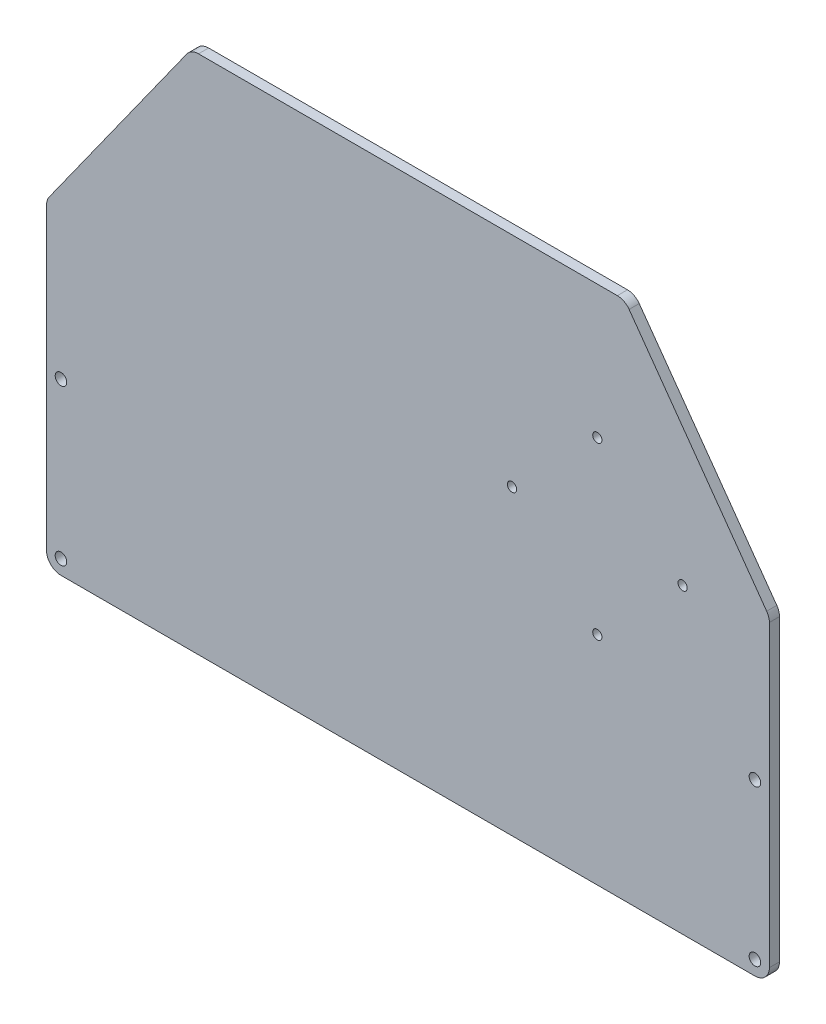
ISO-10303-21;
HEADER;
FILE_DESCRIPTION(('STEP AP214'),'2;1');
FILE_NAME('part.step','',(''),(''),'','','');
FILE_SCHEMA(('AUTOMOTIVE_DESIGN { 1 0 10303 214 1 1 1 1 }'));
ENDSEC;
DATA;
#1=APPLICATION_CONTEXT('core data for automotive mechanical design processes');
#2=APPLICATION_PROTOCOL_DEFINITION('international standard','automotive_design',2000,#1);
#3=PRODUCT_CONTEXT('',#1,'mechanical');
#4=PRODUCT('Part','Part','',(#3));
#5=PRODUCT_RELATED_PRODUCT_CATEGORY('part','',(#4));
#6=PRODUCT_DEFINITION_FORMATION('','',#4);
#7=PRODUCT_DEFINITION_CONTEXT('part definition',#1,'design');
#8=PRODUCT_DEFINITION('design','',#6,#7);
#9=PRODUCT_DEFINITION_SHAPE('','',#8);
#10=(LENGTH_UNIT() NAMED_UNIT(*) SI_UNIT(.MILLI.,.METRE.));
#11=(NAMED_UNIT(*) PLANE_ANGLE_UNIT() SI_UNIT($,.RADIAN.));
#12=(NAMED_UNIT(*) SI_UNIT($,.STERADIAN.) SOLID_ANGLE_UNIT());
#13=UNCERTAINTY_MEASURE_WITH_UNIT(LENGTH_MEASURE(1.E-05),#10,'distance_accuracy_value','');
#14=(GEOMETRIC_REPRESENTATION_CONTEXT(3) GLOBAL_UNCERTAINTY_ASSIGNED_CONTEXT((#13)) GLOBAL_UNIT_ASSIGNED_CONTEXT((#10,
#11,#12)) REPRESENTATION_CONTEXT('',''));
#15=CARTESIAN_POINT('',(0.,0.,0.));
#16=DIRECTION('',(0.,0.,1.));
#17=DIRECTION('',(1.,0.,0.));
#18=AXIS2_PLACEMENT_3D('',#15,#16,#17);
#19=CARTESIAN_POINT('',(250.,5.,3.5));
#20=DIRECTION('',(-1.,0.,0.));
#21=DIRECTION('',(0.,0.,1.));
#22=AXIS2_PLACEMENT_3D('',#19,#20,#21);
#23=PLANE('',#22);
#24=DIRECTION('',(0.,1.,0.));
#25=VECTOR('',#24,1.);
#26=CARTESIAN_POINT('',(250.,5.,0.));
#27=LINE('',#26,#25);
#28=CARTESIAN_POINT('',(250.,5.,0.));
#29=VERTEX_POINT('',#28);
#30=CARTESIAN_POINT('',(250.,108.397674732957,0.));
#31=VERTEX_POINT('',#30);
#32=EDGE_CURVE('E221',#29,#31,#27,.T.);
#33=ORIENTED_EDGE('',*,*,#32,.T.);
#34=DIRECTION('',(0.,0.,-1.));
#35=VECTOR('',#34,1.);
#36=CARTESIAN_POINT('',(250.,108.397674732957,3.5));
#37=LINE('',#36,#35);
#38=CARTESIAN_POINT('',(250.,108.397674732957,3.5));
#39=VERTEX_POINT('',#38);
#40=EDGE_CURVE('E175',#31,#39,#37,.F.);
#41=ORIENTED_EDGE('',*,*,#40,.T.);
#42=DIRECTION('',(0.,1.,0.));
#43=VECTOR('',#42,1.);
#44=CARTESIAN_POINT('',(250.,5.,3.5));
#45=LINE('',#44,#43);
#46=CARTESIAN_POINT('',(250.,5.,3.5));
#47=VERTEX_POINT('',#46);
#48=EDGE_CURVE('E209',#47,#39,#45,.T.);
#49=ORIENTED_EDGE('',*,*,#48,.F.);
#50=DIRECTION('',(0.,0.,-1.));
#51=VECTOR('',#50,1.);
#52=CARTESIAN_POINT('',(250.,5.,3.5));
#53=LINE('',#52,#51);
#54=EDGE_CURVE('E153',#47,#29,#53,.T.);
#55=ORIENTED_EDGE('',*,*,#54,.T.);
#56=EDGE_LOOP('',(#33,#41,#49,#55));
#57=FACE_BOUND('',#56,.T.);
#58=ADVANCED_FACE('F32',(#57),#23,.F.);
#59=CARTESIAN_POINT('',(0.,5.00000000000004,3.5));
#60=DIRECTION('',(1.,0.,0.));
#61=DIRECTION('',(0.,0.,-1.));
#62=AXIS2_PLACEMENT_3D('',#59,#60,#61);
#63=PLANE('',#62);
#64=DIRECTION('',(0.,-1.,0.));
#65=VECTOR('',#64,1.);
#66=CARTESIAN_POINT('',(0.,5.00000000000004,3.5));
#67=LINE('',#66,#65);
#68=CARTESIAN_POINT('',(0.,108.397674732957,3.5));
#69=VERTEX_POINT('',#68);
#70=CARTESIAN_POINT('',(0.,5.00000000000004,3.5));
#71=VERTEX_POINT('',#70);
#72=EDGE_CURVE('E139',#69,#71,#67,.T.);
#73=ORIENTED_EDGE('',*,*,#72,.F.);
#74=DIRECTION('',(0.,0.,-1.));
#75=VECTOR('',#74,1.);
#76=CARTESIAN_POINT('',(0.,108.397674732957,0.));
#77=LINE('',#76,#75);
#78=CARTESIAN_POINT('',(0.,108.397674732957,0.));
#79=VERTEX_POINT('',#78);
#80=EDGE_CURVE('E11',#69,#79,#77,.T.);
#81=ORIENTED_EDGE('',*,*,#80,.T.);
#82=DIRECTION('',(0.,-1.,0.));
#83=VECTOR('',#82,1.);
#84=CARTESIAN_POINT('',(0.,5.00000000000004,0.));
#85=LINE('',#84,#83);
#86=CARTESIAN_POINT('',(0.,5.00000000000004,0.));
#87=VERTEX_POINT('',#86);
#88=EDGE_CURVE('E143',#79,#87,#85,.T.);
#89=ORIENTED_EDGE('',*,*,#88,.T.);
#90=DIRECTION('',(0.,0.,-1.));
#91=VECTOR('',#90,1.);
#92=CARTESIAN_POINT('',(0.,5.00000000000004,3.5));
#93=LINE('',#92,#91);
#94=EDGE_CURVE('E208',#71,#87,#93,.T.);
#95=ORIENTED_EDGE('',*,*,#94,.F.);
#96=EDGE_LOOP('',(#73,#81,#89,#95));
#97=FACE_BOUND('',#96,.T.);
#98=ADVANCED_FACE('F207',(#97),#63,.F.);
#99=CARTESIAN_POINT('',(5.,5.,3.5));
#100=DIRECTION('',(0.,0.,-1.));
#101=DIRECTION('',(-1.,0.,0.));
#102=AXIS2_PLACEMENT_3D('',#99,#100,#101);
#103=PLANE('',#102);
#104=CARTESIAN_POINT('',(190.499010186097,134.,3.5));
#105=DIRECTION('',(0.,0.,1.));
#106=DIRECTION('',(1.,0.,0.));
#107=AXIS2_PLACEMENT_3D('',#104,#105,#106);
#108=CIRCLE('',#107,1.59999999999999);
#109=CARTESIAN_POINT('',(192.099010186097,134.,3.5));
#110=VERTEX_POINT('',#109);
#111=EDGE_CURVE('E340',#110,#110,#108,.T.);
#112=ORIENTED_EDGE('',*,*,#111,.F.);
#113=EDGE_LOOP('',(#112));
#114=FACE_BOUND('',#113,.T.);
#115=CARTESIAN_POINT('',(160.998020372194,104.5,3.5));
#116=DIRECTION('',(0.,0.,1.));
#117=DIRECTION('',(1.,0.,0.));
#118=AXIS2_PLACEMENT_3D('',#115,#116,#117);
#119=CIRCLE('',#118,1.59999999999999);
#120=CARTESIAN_POINT('',(162.598020372194,104.5,3.5));
#121=VERTEX_POINT('',#120);
#122=EDGE_CURVE('E345',#121,#121,#119,.T.);
#123=ORIENTED_EDGE('',*,*,#122,.F.);
#124=EDGE_LOOP('',(#123));
#125=FACE_BOUND('',#124,.T.);
#126=CARTESIAN_POINT('',(190.499010186097,75.,3.5));
#127=DIRECTION('',(0.,0.,1.));
#128=DIRECTION('',(1.,0.,0.));
#129=AXIS2_PLACEMENT_3D('',#126,#127,#128);
#130=CIRCLE('',#129,1.59999999999999);
#131=CARTESIAN_POINT('',(192.099010186097,75.,3.5));
#132=VERTEX_POINT('',#131);
#133=EDGE_CURVE('E353',#132,#132,#130,.T.);
#134=ORIENTED_EDGE('',*,*,#133,.F.);
#135=EDGE_LOOP('',(#134));
#136=FACE_BOUND('',#135,.T.);
#137=CARTESIAN_POINT('',(220.,104.5,3.5));
#138=DIRECTION('',(0.,0.,1.));
#139=DIRECTION('',(1.,0.,0.));
#140=AXIS2_PLACEMENT_3D('',#137,#138,#139);
#141=CIRCLE('',#140,1.59999999999999);
#142=CARTESIAN_POINT('',(221.6,104.5,3.5));
#143=VERTEX_POINT('',#142);
#144=EDGE_CURVE('E247',#143,#143,#141,.T.);
#145=ORIENTED_EDGE('',*,*,#144,.F.);
#146=EDGE_LOOP('',(#145));
#147=FACE_BOUND('',#146,.T.);
#148=CARTESIAN_POINT('',(5.,5.,3.5));
#149=DIRECTION('',(0.,0.,1.));
#150=DIRECTION('',(1.,0.,0.));
#151=AXIS2_PLACEMENT_3D('',#148,#149,#150);
#152=CIRCLE('',#151,2.);
#153=CARTESIAN_POINT('',(7.,5.,3.5));
#154=VERTEX_POINT('',#153);
#155=EDGE_CURVE('E256',#154,#154,#152,.T.);
#156=ORIENTED_EDGE('',*,*,#155,.F.);
#157=EDGE_LOOP('',(#156));
#158=FACE_BOUND('',#157,.T.);
#159=CARTESIAN_POINT('',(245.,58.8,3.5));
#160=DIRECTION('',(0.,0.,1.));
#161=DIRECTION('',(1.,0.,0.));
#162=AXIS2_PLACEMENT_3D('',#159,#160,#161);
#163=CIRCLE('',#162,2.);
#164=CARTESIAN_POINT('',(247.,58.8,3.5));
#165=VERTEX_POINT('',#164);
#166=EDGE_CURVE('E252',#165,#165,#163,.T.);
#167=ORIENTED_EDGE('',*,*,#166,.F.);
#168=EDGE_LOOP('',(#167));
#169=FACE_BOUND('',#168,.T.);
#170=CARTESIAN_POINT('',(5.,58.8,3.5));
#171=DIRECTION('',(0.,0.,1.));
#172=DIRECTION('',(1.,0.,0.));
#173=AXIS2_PLACEMENT_3D('',#170,#171,#172);
#174=CIRCLE('',#173,2.);
#175=CARTESIAN_POINT('',(7.,58.8,3.5));
#176=VERTEX_POINT('',#175);
#177=EDGE_CURVE('E263',#176,#176,#174,.T.);
#178=ORIENTED_EDGE('',*,*,#177,.F.);
#179=EDGE_LOOP('',(#178));
#180=FACE_BOUND('',#179,.T.);
#181=CARTESIAN_POINT('',(245.,5.,3.5));
#182=DIRECTION('',(0.,0.,1.));
#183=DIRECTION('',(1.,0.,0.));
#184=AXIS2_PLACEMENT_3D('',#181,#182,#183);
#185=CIRCLE('',#184,2.);
#186=CARTESIAN_POINT('',(247.,5.,3.5));
#187=VERTEX_POINT('',#186);
#188=EDGE_CURVE('E257',#187,#187,#185,.T.);
#189=ORIENTED_EDGE('',*,*,#188,.F.);
#190=EDGE_LOOP('',(#189));
#191=FACE_BOUND('',#190,.T.);
#192=ORIENTED_EDGE('',*,*,#48,.T.);
#193=CARTESIAN_POINT('',(245.,108.397674732957,3.5));
#194=DIRECTION('',(0.,0.,-1.));
#195=DIRECTION('',(-1.,0.,0.));
#196=AXIS2_PLACEMENT_3D('',#193,#194,#195);
#197=CIRCLE('',#196,5.);
#198=CARTESIAN_POINT('',(249.068667356034,111.303865701553,3.5));
#199=VERTEX_POINT('',#198);
#200=EDGE_CURVE('E182',#39,#199,#197,.F.);
#201=ORIENTED_EDGE('',*,*,#200,.T.);
#202=DIRECTION('',(0.581238193719096,-0.813733471206735,0.));
#203=VECTOR('',#202,1.);
#204=CARTESIAN_POINT('',(216.891891891892,156.351351351351,3.5));
#205=LINE('',#204,#203);
#206=CARTESIAN_POINT('',(201.495577879575,177.906190968595,3.5));
#207=VERTEX_POINT('',#206);
#208=EDGE_CURVE('E241',#207,#199,#205,.T.);
#209=ORIENTED_EDGE('',*,*,#208,.F.);
#210=CARTESIAN_POINT('',(197.426910523541,175.,3.5));
#211=DIRECTION('',(0.,0.,-1.));
#212=DIRECTION('',(-1.,0.,0.));
#213=AXIS2_PLACEMENT_3D('',#210,#211,#212);
#214=CIRCLE('',#213,5.);
#215=CARTESIAN_POINT('',(197.426910523541,180.,3.5));
#216=VERTEX_POINT('',#215);
#217=EDGE_CURVE('E47',#207,#216,#214,.F.);
#218=ORIENTED_EDGE('',*,*,#217,.T.);
#219=DIRECTION('',(1.,0.,0.));
#220=VECTOR('',#219,1.);
#221=CARTESIAN_POINT('',(5.,180.,3.5));
#222=LINE('',#221,#220);
#223=CARTESIAN_POINT('',(52.573089476459,180.,3.5));
#224=VERTEX_POINT('',#223);
#225=EDGE_CURVE('E242',#224,#216,#222,.T.);
#226=ORIENTED_EDGE('',*,*,#225,.F.);
#227=CARTESIAN_POINT('',(52.573089476459,175.,3.5));
#228=DIRECTION('',(0.,0.,-1.));
#229=DIRECTION('',(-1.,0.,0.));
#230=AXIS2_PLACEMENT_3D('',#227,#228,#229);
#231=CIRCLE('',#230,5.);
#232=CARTESIAN_POINT('',(48.5044221204253,177.906190968595,3.5));
#233=VERTEX_POINT('',#232);
#234=EDGE_CURVE('E179',#224,#233,#231,.F.);
#235=ORIENTED_EDGE('',*,*,#234,.T.);
#236=DIRECTION('',(0.581238193719096,0.813733471206735,0.));
#237=VECTOR('',#236,1.);
#238=CARTESIAN_POINT('',(-47.972972972973,42.8378378378378,3.5));
#239=LINE('',#238,#237);
#240=CARTESIAN_POINT('',(0.931332643966325,111.303865701553,3.5));
#241=VERTEX_POINT('',#240);
#242=EDGE_CURVE('E197',#241,#233,#239,.T.);
#243=ORIENTED_EDGE('',*,*,#242,.F.);
#244=CARTESIAN_POINT('',(5.,108.397674732957,3.5));
#245=DIRECTION('',(0.,0.,-1.));
#246=DIRECTION('',(-1.,0.,0.));
#247=AXIS2_PLACEMENT_3D('',#244,#245,#246);
#248=CIRCLE('',#247,5.);
#249=EDGE_CURVE('E177',#241,#69,#248,.F.);
#250=ORIENTED_EDGE('',*,*,#249,.T.);
#251=ORIENTED_EDGE('',*,*,#72,.T.);
#252=CARTESIAN_POINT('',(5.,5.,3.5));
#253=DIRECTION('',(0.,0.,1.));
#254=DIRECTION('',(-1.,0.,0.));
#255=AXIS2_PLACEMENT_3D('',#252,#253,#254);
#256=CIRCLE('',#255,5.);
#257=CARTESIAN_POINT('',(5.00000000000004,0.,3.5));
#258=VERTEX_POINT('',#257);
#259=EDGE_CURVE('E133',#71,#258,#256,.T.);
#260=ORIENTED_EDGE('',*,*,#259,.T.);
#261=DIRECTION('',(1.,0.,0.));
#262=VECTOR('',#261,1.);
#263=CARTESIAN_POINT('',(5.00000000000004,0.,3.5));
#264=LINE('',#263,#262);
#265=CARTESIAN_POINT('',(245.,0.,3.5));
#266=VERTEX_POINT('',#265);
#267=EDGE_CURVE('E123',#258,#266,#264,.T.);
#268=ORIENTED_EDGE('',*,*,#267,.T.);
#269=CARTESIAN_POINT('',(245.,5.,3.5));
#270=DIRECTION('',(0.,0.,1.));
#271=DIRECTION('',(-1.,0.,0.));
#272=AXIS2_PLACEMENT_3D('',#269,#270,#271);
#273=CIRCLE('',#272,5.);
#274=EDGE_CURVE('E132',#266,#47,#273,.T.);
#275=ORIENTED_EDGE('',*,*,#274,.T.);
#276=EDGE_LOOP('',(#192,#201,#209,#218,#226,#235,#243,#250,#251,#260,#268,#275));
#277=FACE_BOUND('',#276,.T.);
#278=ADVANCED_FACE('F137',(#114,#125,#136,#147,#158,#169,#180,#191,#277),#103,.F.);
#279=CARTESIAN_POINT('',(5.,5.,0.));
#280=DIRECTION('',(0.,0.,-1.));
#281=DIRECTION('',(-1.,0.,0.));
#282=AXIS2_PLACEMENT_3D('',#279,#280,#281);
#283=PLANE('',#282);
#284=CARTESIAN_POINT('',(190.499010186097,134.,0.));
#285=DIRECTION('',(0.,0.,1.));
#286=DIRECTION('',(1.,0.,0.));
#287=AXIS2_PLACEMENT_3D('',#284,#285,#286);
#288=CIRCLE('',#287,1.59999999999999);
#289=CARTESIAN_POINT('',(192.099010186097,134.,0.));
#290=VERTEX_POINT('',#289);
#291=EDGE_CURVE('E337',#290,#290,#288,.T.);
#292=ORIENTED_EDGE('',*,*,#291,.T.);
#293=EDGE_LOOP('',(#292));
#294=FACE_BOUND('',#293,.T.);
#295=CARTESIAN_POINT('',(160.998020372194,104.5,0.));
#296=DIRECTION('',(0.,0.,1.));
#297=DIRECTION('',(1.,0.,0.));
#298=AXIS2_PLACEMENT_3D('',#295,#296,#297);
#299=CIRCLE('',#298,1.59999999999999);
#300=CARTESIAN_POINT('',(162.598020372194,104.5,0.));
#301=VERTEX_POINT('',#300);
#302=EDGE_CURVE('E341',#301,#301,#299,.T.);
#303=ORIENTED_EDGE('',*,*,#302,.T.);
#304=EDGE_LOOP('',(#303));
#305=FACE_BOUND('',#304,.T.);
#306=CARTESIAN_POINT('',(190.499010186097,75.,0.));
#307=DIRECTION('',(0.,0.,1.));
#308=DIRECTION('',(1.,0.,0.));
#309=AXIS2_PLACEMENT_3D('',#306,#307,#308);
#310=CIRCLE('',#309,1.59999999999999);
#311=CARTESIAN_POINT('',(192.099010186097,75.,0.));
#312=VERTEX_POINT('',#311);
#313=EDGE_CURVE('E350',#312,#312,#310,.T.);
#314=ORIENTED_EDGE('',*,*,#313,.T.);
#315=EDGE_LOOP('',(#314));
#316=FACE_BOUND('',#315,.T.);
#317=CARTESIAN_POINT('',(220.,104.5,0.));
#318=DIRECTION('',(0.,0.,1.));
#319=DIRECTION('',(1.,0.,0.));
#320=AXIS2_PLACEMENT_3D('',#317,#318,#319);
#321=CIRCLE('',#320,1.59999999999999);
#322=CARTESIAN_POINT('',(221.6,104.5,0.));
#323=VERTEX_POINT('',#322);
#324=EDGE_CURVE('E243',#323,#323,#321,.T.);
#325=ORIENTED_EDGE('',*,*,#324,.T.);
#326=EDGE_LOOP('',(#325));
#327=FACE_BOUND('',#326,.T.);
#328=CARTESIAN_POINT('',(245.,5.,0.));
#329=DIRECTION('',(0.,0.,1.));
#330=DIRECTION('',(1.,0.,0.));
#331=AXIS2_PLACEMENT_3D('',#328,#329,#330);
#332=CIRCLE('',#331,2.);
#333=CARTESIAN_POINT('',(247.,5.,0.));
#334=VERTEX_POINT('',#333);
#335=EDGE_CURVE('E253',#334,#334,#332,.T.);
#336=ORIENTED_EDGE('',*,*,#335,.T.);
#337=EDGE_LOOP('',(#336));
#338=FACE_BOUND('',#337,.T.);
#339=CARTESIAN_POINT('',(5.,58.8,0.));
#340=DIRECTION('',(0.,0.,1.));
#341=DIRECTION('',(1.,0.,0.));
#342=AXIS2_PLACEMENT_3D('',#339,#340,#341);
#343=CIRCLE('',#342,2.);
#344=CARTESIAN_POINT('',(7.,58.8,0.));
#345=VERTEX_POINT('',#344);
#346=EDGE_CURVE('E260',#345,#345,#343,.T.);
#347=ORIENTED_EDGE('',*,*,#346,.T.);
#348=EDGE_LOOP('',(#347));
#349=FACE_BOUND('',#348,.T.);
#350=CARTESIAN_POINT('',(245.,58.8,0.));
#351=DIRECTION('',(0.,0.,1.));
#352=DIRECTION('',(1.,0.,0.));
#353=AXIS2_PLACEMENT_3D('',#350,#351,#352);
#354=CIRCLE('',#353,2.);
#355=CARTESIAN_POINT('',(247.,58.8,0.));
#356=VERTEX_POINT('',#355);
#357=EDGE_CURVE('E266',#356,#356,#354,.T.);
#358=ORIENTED_EDGE('',*,*,#357,.T.);
#359=EDGE_LOOP('',(#358));
#360=FACE_BOUND('',#359,.T.);
#361=CARTESIAN_POINT('',(5.,5.,0.));
#362=DIRECTION('',(0.,0.,1.));
#363=DIRECTION('',(1.,0.,0.));
#364=AXIS2_PLACEMENT_3D('',#361,#362,#363);
#365=CIRCLE('',#364,2.);
#366=CARTESIAN_POINT('',(7.,5.,0.));
#367=VERTEX_POINT('',#366);
#368=EDGE_CURVE('E217',#367,#367,#365,.T.);
#369=ORIENTED_EDGE('',*,*,#368,.T.);
#370=EDGE_LOOP('',(#369));
#371=FACE_BOUND('',#370,.T.);
#372=DIRECTION('',(0.581238193719096,-0.813733471206735,0.));
#373=VECTOR('',#372,1.);
#374=CARTESIAN_POINT('',(216.891891891892,156.351351351351,0.));
#375=LINE('',#374,#373);
#376=CARTESIAN_POINT('',(201.495577879575,177.906190968595,0.));
#377=VERTEX_POINT('',#376);
#378=CARTESIAN_POINT('',(249.068667356034,111.303865701553,0.));
#379=VERTEX_POINT('',#378);
#380=EDGE_CURVE('E148',#377,#379,#375,.T.);
#381=ORIENTED_EDGE('',*,*,#380,.T.);
#382=CARTESIAN_POINT('',(245.,108.397674732957,0.));
#383=DIRECTION('',(0.,0.,-1.));
#384=DIRECTION('',(-1.,0.,0.));
#385=AXIS2_PLACEMENT_3D('',#382,#383,#384);
#386=CIRCLE('',#385,5.);
#387=EDGE_CURVE('E173',#379,#31,#386,.T.);
#388=ORIENTED_EDGE('',*,*,#387,.T.);
#389=ORIENTED_EDGE('',*,*,#32,.F.);
#390=CARTESIAN_POINT('',(245.,5.,0.));
#391=DIRECTION('',(0.,0.,1.));
#392=DIRECTION('',(-1.,0.,0.));
#393=AXIS2_PLACEMENT_3D('',#390,#391,#392);
#394=CIRCLE('',#393,5.);
#395=CARTESIAN_POINT('',(245.,0.,0.));
#396=VERTEX_POINT('',#395);
#397=EDGE_CURVE('E219',#396,#29,#394,.T.);
#398=ORIENTED_EDGE('',*,*,#397,.F.);
#399=DIRECTION('',(1.,0.,0.));
#400=VECTOR('',#399,1.);
#401=CARTESIAN_POINT('',(5.00000000000004,0.,0.));
#402=LINE('',#401,#400);
#403=CARTESIAN_POINT('',(5.00000000000004,0.,0.));
#404=VERTEX_POINT('',#403);
#405=EDGE_CURVE('E216',#404,#396,#402,.T.);
#406=ORIENTED_EDGE('',*,*,#405,.F.);
#407=CARTESIAN_POINT('',(5.,5.,0.));
#408=DIRECTION('',(0.,0.,1.));
#409=DIRECTION('',(-1.,0.,0.));
#410=AXIS2_PLACEMENT_3D('',#407,#408,#409);
#411=CIRCLE('',#410,5.);
#412=EDGE_CURVE('E147',#87,#404,#411,.T.);
#413=ORIENTED_EDGE('',*,*,#412,.F.);
#414=ORIENTED_EDGE('',*,*,#88,.F.);
#415=CARTESIAN_POINT('',(5.,108.397674732957,0.));
#416=DIRECTION('',(0.,0.,-1.));
#417=DIRECTION('',(-1.,0.,0.));
#418=AXIS2_PLACEMENT_3D('',#415,#416,#417);
#419=CIRCLE('',#418,5.);
#420=CARTESIAN_POINT('',(0.931332643966325,111.303865701553,0.));
#421=VERTEX_POINT('',#420);
#422=EDGE_CURVE('E167',#79,#421,#419,.T.);
#423=ORIENTED_EDGE('',*,*,#422,.T.);
#424=DIRECTION('',(0.581238193719096,0.813733471206735,0.));
#425=VECTOR('',#424,1.);
#426=CARTESIAN_POINT('',(-47.972972972973,42.8378378378378,0.));
#427=LINE('',#426,#425);
#428=CARTESIAN_POINT('',(48.5044221204253,177.906190968595,0.));
#429=VERTEX_POINT('',#428);
#430=EDGE_CURVE('E159',#421,#429,#427,.T.);
#431=ORIENTED_EDGE('',*,*,#430,.T.);
#432=CARTESIAN_POINT('',(52.573089476459,175.,0.));
#433=DIRECTION('',(0.,0.,-1.));
#434=DIRECTION('',(-1.,0.,0.));
#435=AXIS2_PLACEMENT_3D('',#432,#433,#434);
#436=CIRCLE('',#435,5.);
#437=CARTESIAN_POINT('',(52.573089476459,180.,0.));
#438=VERTEX_POINT('',#437);
#439=EDGE_CURVE('E169',#429,#438,#436,.T.);
#440=ORIENTED_EDGE('',*,*,#439,.T.);
#441=DIRECTION('',(1.,0.,0.));
#442=VECTOR('',#441,1.);
#443=CARTESIAN_POINT('',(5.,180.,0.));
#444=LINE('',#443,#442);
#445=CARTESIAN_POINT('',(197.426910523541,180.,0.));
#446=VERTEX_POINT('',#445);
#447=EDGE_CURVE('E151',#438,#446,#444,.T.);
#448=ORIENTED_EDGE('',*,*,#447,.T.);
#449=CARTESIAN_POINT('',(197.426910523541,175.,0.));
#450=DIRECTION('',(0.,0.,-1.));
#451=DIRECTION('',(-1.,0.,0.));
#452=AXIS2_PLACEMENT_3D('',#449,#450,#451);
#453=CIRCLE('',#452,5.);
#454=EDGE_CURVE('E171',#446,#377,#453,.T.);
#455=ORIENTED_EDGE('',*,*,#454,.T.);
#456=EDGE_LOOP('',(#381,#388,#389,#398,#406,#413,#414,#423,#431,#440,#448,#455));
#457=FACE_BOUND('',#456,.T.);
#458=ADVANCED_FACE('F201',(#294,#305,#316,#327,#338,#349,#360,#371,#457),#283,.T.);
#459=CARTESIAN_POINT('',(5.,5.,3.5));
#460=DIRECTION('',(0.,0.,-1.));
#461=DIRECTION('',(-1.,0.,0.));
#462=AXIS2_PLACEMENT_3D('',#459,#460,#461);
#463=CYLINDRICAL_SURFACE('',#462,5.);
#464=ORIENTED_EDGE('',*,*,#412,.T.);
#465=DIRECTION('',(0.,0.,-1.));
#466=VECTOR('',#465,1.);
#467=CARTESIAN_POINT('',(5.00000000000004,0.,3.5));
#468=LINE('',#467,#466);
#469=EDGE_CURVE('E127',#258,#404,#468,.T.);
#470=ORIENTED_EDGE('',*,*,#469,.F.);
#471=ORIENTED_EDGE('',*,*,#259,.F.);
#472=ORIENTED_EDGE('',*,*,#94,.T.);
#473=EDGE_LOOP('',(#464,#470,#471,#472));
#474=FACE_BOUND('',#473,.T.);
#475=ADVANCED_FACE('F145',(#474),#463,.T.);
#476=CARTESIAN_POINT('',(5.00000000000004,0.,3.5));
#477=DIRECTION('',(0.,1.,0.));
#478=DIRECTION('',(0.,0.,1.));
#479=AXIS2_PLACEMENT_3D('',#476,#477,#478);
#480=PLANE('',#479);
#481=ORIENTED_EDGE('',*,*,#405,.T.);
#482=DIRECTION('',(0.,0.,-1.));
#483=VECTOR('',#482,1.);
#484=CARTESIAN_POINT('',(245.,0.,3.5));
#485=LINE('',#484,#483);
#486=EDGE_CURVE('E130',#266,#396,#485,.T.);
#487=ORIENTED_EDGE('',*,*,#486,.F.);
#488=ORIENTED_EDGE('',*,*,#267,.F.);
#489=ORIENTED_EDGE('',*,*,#469,.T.);
#490=EDGE_LOOP('',(#481,#487,#488,#489));
#491=FACE_BOUND('',#490,.T.);
#492=ADVANCED_FACE('F125',(#491),#480,.F.);
#493=CARTESIAN_POINT('',(245.,5.,3.5));
#494=DIRECTION('',(0.,0.,-1.));
#495=DIRECTION('',(-1.,0.,0.));
#496=AXIS2_PLACEMENT_3D('',#493,#494,#495);
#497=CYLINDRICAL_SURFACE('',#496,5.);
#498=ORIENTED_EDGE('',*,*,#397,.T.);
#499=ORIENTED_EDGE('',*,*,#54,.F.);
#500=ORIENTED_EDGE('',*,*,#274,.F.);
#501=ORIENTED_EDGE('',*,*,#486,.T.);
#502=EDGE_LOOP('',(#498,#499,#500,#501));
#503=FACE_BOUND('',#502,.T.);
#504=ADVANCED_FACE('F274',(#503),#497,.T.);
#505=CARTESIAN_POINT('',(5.,5.,0.));
#506=DIRECTION('',(0.,0.,1.));
#507=DIRECTION('',(1.,0.,0.));
#508=AXIS2_PLACEMENT_3D('',#505,#506,#507);
#509=CYLINDRICAL_SURFACE('',#508,2.);
#510=ORIENTED_EDGE('',*,*,#368,.F.);
#511=EDGE_LOOP('',(#510));
#512=FACE_BOUND('',#511,.T.);
#513=ORIENTED_EDGE('',*,*,#155,.T.);
#514=EDGE_LOOP('',(#513));
#515=FACE_BOUND('',#514,.T.);
#516=ADVANCED_FACE('F276',(#512,#515),#509,.F.);
#517=CARTESIAN_POINT('',(245.,58.8,0.));
#518=DIRECTION('',(0.,0.,1.));
#519=DIRECTION('',(1.,0.,0.));
#520=AXIS2_PLACEMENT_3D('',#517,#518,#519);
#521=CYLINDRICAL_SURFACE('',#520,2.);
#522=ORIENTED_EDGE('',*,*,#357,.F.);
#523=EDGE_LOOP('',(#522));
#524=FACE_BOUND('',#523,.T.);
#525=ORIENTED_EDGE('',*,*,#166,.T.);
#526=EDGE_LOOP('',(#525));
#527=FACE_BOUND('',#526,.T.);
#528=ADVANCED_FACE('F282',(#524,#527),#521,.F.);
#529=CARTESIAN_POINT('',(5.,58.8,0.));
#530=DIRECTION('',(0.,0.,1.));
#531=DIRECTION('',(1.,0.,0.));
#532=AXIS2_PLACEMENT_3D('',#529,#530,#531);
#533=CYLINDRICAL_SURFACE('',#532,2.);
#534=ORIENTED_EDGE('',*,*,#346,.F.);
#535=EDGE_LOOP('',(#534));
#536=FACE_BOUND('',#535,.T.);
#537=ORIENTED_EDGE('',*,*,#177,.T.);
#538=EDGE_LOOP('',(#537));
#539=FACE_BOUND('',#538,.T.);
#540=ADVANCED_FACE('F301',(#536,#539),#533,.F.);
#541=CARTESIAN_POINT('',(245.,5.,0.));
#542=DIRECTION('',(0.,0.,1.));
#543=DIRECTION('',(1.,0.,0.));
#544=AXIS2_PLACEMENT_3D('',#541,#542,#543);
#545=CYLINDRICAL_SURFACE('',#544,2.);
#546=ORIENTED_EDGE('',*,*,#335,.F.);
#547=EDGE_LOOP('',(#546));
#548=FACE_BOUND('',#547,.T.);
#549=ORIENTED_EDGE('',*,*,#188,.T.);
#550=EDGE_LOOP('',(#549));
#551=FACE_BOUND('',#550,.T.);
#552=ADVANCED_FACE('F305',(#548,#551),#545,.F.);
#553=CARTESIAN_POINT('',(0.,110.,500.852639579119));
#554=DIRECTION('',(-0.813733471206735,0.581238193719096,0.));
#555=DIRECTION('',(-0.581238193719096,-0.813733471206735,0.));
#556=AXIS2_PLACEMENT_3D('',#553,#554,#555);
#557=PLANE('',#556);
#558=ORIENTED_EDGE('',*,*,#242,.T.);
#559=DIRECTION('',(0.,0.,-1.));
#560=VECTOR('',#559,1.);
#561=CARTESIAN_POINT('',(48.5044221204253,177.906190968595,500.852639579119));
#562=LINE('',#561,#560);
#563=EDGE_CURVE('E40',#233,#429,#562,.T.);
#564=ORIENTED_EDGE('',*,*,#563,.T.);
#565=ORIENTED_EDGE('',*,*,#430,.F.);
#566=DIRECTION('',(0.,0.,-1.));
#567=VECTOR('',#566,1.);
#568=CARTESIAN_POINT('',(0.931332643966327,111.303865701553,3.5));
#569=LINE('',#568,#567);
#570=EDGE_CURVE('E188',#421,#241,#569,.F.);
#571=ORIENTED_EDGE('',*,*,#570,.T.);
#572=EDGE_LOOP('',(#558,#564,#565,#571));
#573=FACE_BOUND('',#572,.T.);
#574=ADVANCED_FACE('F194',(#573),#557,.T.);
#575=CARTESIAN_POINT('',(50.,180.,500.852639579119));
#576=DIRECTION('',(0.,1.,0.));
#577=DIRECTION('',(0.,0.,1.));
#578=AXIS2_PLACEMENT_3D('',#575,#576,#577);
#579=PLANE('',#578);
#580=ORIENTED_EDGE('',*,*,#225,.T.);
#581=DIRECTION('',(0.,0.,-1.));
#582=VECTOR('',#581,1.);
#583=CARTESIAN_POINT('',(197.426910523541,180.,500.852639579119));
#584=LINE('',#583,#582);
#585=EDGE_CURVE('E185',#216,#446,#584,.T.);
#586=ORIENTED_EDGE('',*,*,#585,.T.);
#587=ORIENTED_EDGE('',*,*,#447,.F.);
#588=DIRECTION('',(0.,0.,-1.));
#589=VECTOR('',#588,1.);
#590=CARTESIAN_POINT('',(52.573089476459,180.,500.852639579119));
#591=LINE('',#590,#589);
#592=EDGE_CURVE('E54',#438,#224,#591,.F.);
#593=ORIENTED_EDGE('',*,*,#592,.T.);
#594=EDGE_LOOP('',(#580,#586,#587,#593));
#595=FACE_BOUND('',#594,.T.);
#596=ADVANCED_FACE('F312',(#595),#579,.T.);
#597=CARTESIAN_POINT('',(200.,180.,500.852639579119));
#598=DIRECTION('',(0.813733471206735,0.581238193719096,0.));
#599=DIRECTION('',(-0.581238193719096,0.813733471206735,0.));
#600=AXIS2_PLACEMENT_3D('',#597,#598,#599);
#601=PLANE('',#600);
#602=ORIENTED_EDGE('',*,*,#208,.T.);
#603=DIRECTION('',(0.,0.,-1.));
#604=VECTOR('',#603,1.);
#605=CARTESIAN_POINT('',(249.068667356034,111.303865701553,0.));
#606=LINE('',#605,#604);
#607=EDGE_CURVE('E164',#199,#379,#606,.T.);
#608=ORIENTED_EDGE('',*,*,#607,.T.);
#609=ORIENTED_EDGE('',*,*,#380,.F.);
#610=DIRECTION('',(0.,0.,-1.));
#611=VECTOR('',#610,1.);
#612=CARTESIAN_POINT('',(201.495577879575,177.906190968595,500.852639579119));
#613=LINE('',#612,#611);
#614=EDGE_CURVE('E162',#377,#207,#613,.F.);
#615=ORIENTED_EDGE('',*,*,#614,.T.);
#616=EDGE_LOOP('',(#602,#608,#609,#615));
#617=FACE_BOUND('',#616,.T.);
#618=ADVANCED_FACE('F239',(#617),#601,.T.);
#619=CARTESIAN_POINT('',(245.,108.397674732957,500.852639579119));
#620=DIRECTION('',(0.,0.,1.));
#621=DIRECTION('',(1.,0.,0.));
#622=AXIS2_PLACEMENT_3D('',#619,#620,#621);
#623=CYLINDRICAL_SURFACE('',#622,5.);
#624=ORIENTED_EDGE('',*,*,#200,.F.);
#625=ORIENTED_EDGE('',*,*,#40,.F.);
#626=ORIENTED_EDGE('',*,*,#387,.F.);
#627=ORIENTED_EDGE('',*,*,#607,.F.);
#628=EDGE_LOOP('',(#624,#625,#626,#627));
#629=FACE_BOUND('',#628,.T.);
#630=ADVANCED_FACE('F236',(#629),#623,.T.);
#631=CARTESIAN_POINT('',(197.426910523541,175.,500.852639579119));
#632=DIRECTION('',(0.,0.,-1.));
#633=DIRECTION('',(-1.,0.,0.));
#634=AXIS2_PLACEMENT_3D('',#631,#632,#633);
#635=CYLINDRICAL_SURFACE('',#634,5.);
#636=ORIENTED_EDGE('',*,*,#217,.F.);
#637=ORIENTED_EDGE('',*,*,#614,.F.);
#638=ORIENTED_EDGE('',*,*,#454,.F.);
#639=ORIENTED_EDGE('',*,*,#585,.F.);
#640=EDGE_LOOP('',(#636,#637,#638,#639));
#641=FACE_BOUND('',#640,.T.);
#642=ADVANCED_FACE('F417',(#641),#635,.T.);
#643=CARTESIAN_POINT('',(52.573089476459,175.,500.852639579119));
#644=DIRECTION('',(0.,0.,-1.));
#645=DIRECTION('',(-1.,0.,0.));
#646=AXIS2_PLACEMENT_3D('',#643,#644,#645);
#647=CYLINDRICAL_SURFACE('',#646,5.);
#648=ORIENTED_EDGE('',*,*,#234,.F.);
#649=ORIENTED_EDGE('',*,*,#592,.F.);
#650=ORIENTED_EDGE('',*,*,#439,.F.);
#651=ORIENTED_EDGE('',*,*,#563,.F.);
#652=EDGE_LOOP('',(#648,#649,#650,#651));
#653=FACE_BOUND('',#652,.T.);
#654=ADVANCED_FACE('F410',(#653),#647,.T.);
#655=CARTESIAN_POINT('',(5.,108.397674732957,3.5));
#656=DIRECTION('',(0.,0.,1.));
#657=DIRECTION('',(1.,0.,0.));
#658=AXIS2_PLACEMENT_3D('',#655,#656,#657);
#659=CYLINDRICAL_SURFACE('',#658,5.);
#660=ORIENTED_EDGE('',*,*,#249,.F.);
#661=ORIENTED_EDGE('',*,*,#570,.F.);
#662=ORIENTED_EDGE('',*,*,#422,.F.);
#663=ORIENTED_EDGE('',*,*,#80,.F.);
#664=EDGE_LOOP('',(#660,#661,#662,#663));
#665=FACE_BOUND('',#664,.T.);
#666=ADVANCED_FACE('F34',(#665),#659,.T.);
#667=CARTESIAN_POINT('',(220.,104.5,0.));
#668=DIRECTION('',(0.,0.,1.));
#669=DIRECTION('',(1.,0.,0.));
#670=AXIS2_PLACEMENT_3D('',#667,#668,#669);
#671=CYLINDRICAL_SURFACE('',#670,1.59999999999999);
#672=ORIENTED_EDGE('',*,*,#324,.F.);
#673=EDGE_LOOP('',(#672));
#674=FACE_BOUND('',#673,.T.);
#675=ORIENTED_EDGE('',*,*,#144,.T.);
#676=EDGE_LOOP('',(#675));
#677=FACE_BOUND('',#676,.T.);
#678=ADVANCED_FACE('F317',(#674,#677),#671,.F.);
#679=CARTESIAN_POINT('',(190.499010186097,75.,0.));
#680=DIRECTION('',(0.,0.,1.));
#681=DIRECTION('',(1.,0.,0.));
#682=AXIS2_PLACEMENT_3D('',#679,#680,#681);
#683=CYLINDRICAL_SURFACE('',#682,1.59999999999999);
#684=ORIENTED_EDGE('',*,*,#313,.F.);
#685=EDGE_LOOP('',(#684));
#686=FACE_BOUND('',#685,.T.);
#687=ORIENTED_EDGE('',*,*,#133,.T.);
#688=EDGE_LOOP('',(#687));
#689=FACE_BOUND('',#688,.T.);
#690=ADVANCED_FACE('F320',(#686,#689),#683,.F.);
#691=CARTESIAN_POINT('',(160.998020372194,104.5,0.));
#692=DIRECTION('',(0.,0.,1.));
#693=DIRECTION('',(1.,0.,0.));
#694=AXIS2_PLACEMENT_3D('',#691,#692,#693);
#695=CYLINDRICAL_SURFACE('',#694,1.59999999999999);
#696=ORIENTED_EDGE('',*,*,#302,.F.);
#697=EDGE_LOOP('',(#696));
#698=FACE_BOUND('',#697,.T.);
#699=ORIENTED_EDGE('',*,*,#122,.T.);
#700=EDGE_LOOP('',(#699));
#701=FACE_BOUND('',#700,.T.);
#702=ADVANCED_FACE('F324',(#698,#701),#695,.F.);
#703=CARTESIAN_POINT('',(190.499010186097,134.,0.));
#704=DIRECTION('',(0.,0.,1.));
#705=DIRECTION('',(1.,0.,0.));
#706=AXIS2_PLACEMENT_3D('',#703,#704,#705);
#707=CYLINDRICAL_SURFACE('',#706,1.59999999999999);
#708=ORIENTED_EDGE('',*,*,#291,.F.);
#709=EDGE_LOOP('',(#708));
#710=FACE_BOUND('',#709,.T.);
#711=ORIENTED_EDGE('',*,*,#111,.T.);
#712=EDGE_LOOP('',(#711));
#713=FACE_BOUND('',#712,.T.);
#714=ADVANCED_FACE('F328',(#710,#713),#707,.F.);
#715=CLOSED_SHELL('',(#58,#98,#278,#458,#475,#492,#504,#516,#528,#540,#552,#574,#596,#618,#630,
#642,#654,#666,#678,#690,#702,#714));
#716=MANIFOLD_SOLID_BREP('B2',#715);
#717=ADVANCED_BREP_SHAPE_REPRESENTATION('',(#18,#716),#14);
#718=SHAPE_DEFINITION_REPRESENTATION(#9,#717);
ENDSEC;
END-ISO-10303-21;
